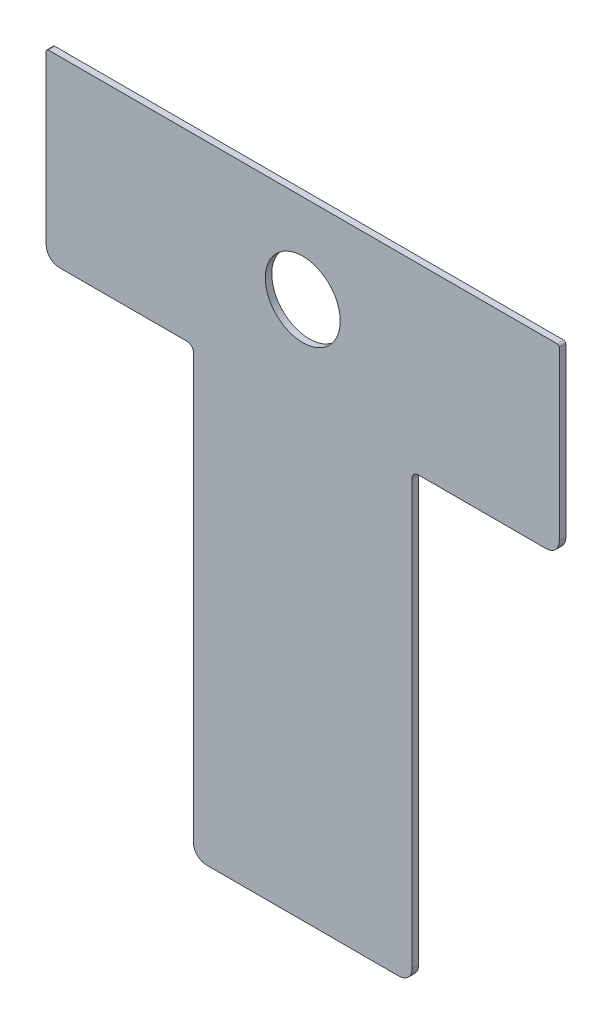
ISO-10303-21;
HEADER;
FILE_DESCRIPTION(('STEP AP214'),'2;1');
FILE_NAME('part.step','',(''),(''),'','','');
FILE_SCHEMA(('AUTOMOTIVE_DESIGN { 1 0 10303 214 1 1 1 1 }'));
ENDSEC;
DATA;
#1=APPLICATION_CONTEXT('core data for automotive mechanical design processes');
#2=APPLICATION_PROTOCOL_DEFINITION('international standard','automotive_design',2000,#1);
#3=PRODUCT_CONTEXT('',#1,'mechanical');
#4=PRODUCT('Part','Part','',(#3));
#5=PRODUCT_RELATED_PRODUCT_CATEGORY('part','',(#4));
#6=PRODUCT_DEFINITION_FORMATION('','',#4);
#7=PRODUCT_DEFINITION_CONTEXT('part definition',#1,'design');
#8=PRODUCT_DEFINITION('design','',#6,#7);
#9=PRODUCT_DEFINITION_SHAPE('','',#8);
#10=(LENGTH_UNIT() NAMED_UNIT(*) SI_UNIT(.MILLI.,.METRE.));
#11=(NAMED_UNIT(*) PLANE_ANGLE_UNIT() SI_UNIT($,.RADIAN.));
#12=(NAMED_UNIT(*) SI_UNIT($,.STERADIAN.) SOLID_ANGLE_UNIT());
#13=UNCERTAINTY_MEASURE_WITH_UNIT(LENGTH_MEASURE(1.E-05),#10,'distance_accuracy_value','');
#14=(GEOMETRIC_REPRESENTATION_CONTEXT(3) GLOBAL_UNCERTAINTY_ASSIGNED_CONTEXT((#13)) GLOBAL_UNIT_ASSIGNED_CONTEXT((#10,
#11,#12)) REPRESENTATION_CONTEXT('',''));
#15=CARTESIAN_POINT('',(0.,0.,0.));
#16=DIRECTION('',(0.,0.,1.));
#17=DIRECTION('',(1.,0.,0.));
#18=AXIS2_PLACEMENT_3D('',#15,#16,#17);
#19=CARTESIAN_POINT('',(-58.75,145.,93.3500000000006));
#20=DIRECTION('',(0.,0.,1.));
#21=DIRECTION('',(0.,-1.,0.));
#22=AXIS2_PLACEMENT_3D('',#19,#20,#21);
#23=CYLINDRICAL_SURFACE('',#22,0.500000000000004);
#24=DIRECTION('',(0.,0.,-1.));
#25=VECTOR('',#24,1.);
#26=CARTESIAN_POINT('',(-59.25,145.,94.1));
#27=LINE('',#26,#25);
#28=CARTESIAN_POINT('',(-59.25,145.,94.8499999999997));
#29=VERTEX_POINT('',#28);
#30=CARTESIAN_POINT('',(-59.25,145.,93.3500000000007));
#31=VERTEX_POINT('',#30);
#32=EDGE_CURVE('E142',#29,#31,#27,.T.);
#33=ORIENTED_EDGE('',*,*,#32,.F.);
#34=CARTESIAN_POINT('',(-58.75,145.,94.8499999999994));
#35=DIRECTION('',(0.,0.,1.));
#36=DIRECTION('',(0.,-1.,0.));
#37=AXIS2_PLACEMENT_3D('',#34,#35,#36);
#38=CIRCLE('',#37,0.500000000000004);
#39=CARTESIAN_POINT('',(-58.75,145.5,94.8499999999997));
#40=VERTEX_POINT('',#39);
#41=EDGE_CURVE('E20',#40,#29,#38,.T.);
#42=ORIENTED_EDGE('',*,*,#41,.F.);
#43=DIRECTION('',(0.,0.,1.));
#44=VECTOR('',#43,1.);
#45=CARTESIAN_POINT('',(-58.75,145.5,94.1));
#46=LINE('',#45,#44);
#47=CARTESIAN_POINT('',(-58.75,145.5,93.3500000000007));
#48=VERTEX_POINT('',#47);
#49=EDGE_CURVE('E196',#48,#40,#46,.T.);
#50=ORIENTED_EDGE('',*,*,#49,.F.);
#51=CARTESIAN_POINT('',(-58.75,145.,93.3500000000006));
#52=DIRECTION('',(0.,0.,1.));
#53=DIRECTION('',(0.,-1.,0.));
#54=AXIS2_PLACEMENT_3D('',#51,#52,#53);
#55=CIRCLE('',#54,0.500000000000004);
#56=EDGE_CURVE('E143',#31,#48,#55,.F.);
#57=ORIENTED_EDGE('',*,*,#56,.F.);
#58=EDGE_LOOP('',(#33,#42,#50,#57));
#59=FACE_BOUND('',#58,.T.);
#60=ADVANCED_FACE('F16',(#59),#23,.T.);
#61=CARTESIAN_POINT('',(58.75,145.,93.3500000000006));
#62=DIRECTION('',(0.,0.,1.));
#63=DIRECTION('',(1.,0.,0.));
#64=AXIS2_PLACEMENT_3D('',#61,#62,#63);
#65=CYLINDRICAL_SURFACE('',#64,0.499999999999973);
#66=DIRECTION('',(0.,0.,-1.));
#67=VECTOR('',#66,1.);
#68=CARTESIAN_POINT('',(58.75,145.5,94.1));
#69=LINE('',#68,#67);
#70=CARTESIAN_POINT('',(58.75,145.5,94.8499999999997));
#71=VERTEX_POINT('',#70);
#72=CARTESIAN_POINT('',(58.75,145.5,93.3500000000007));
#73=VERTEX_POINT('',#72);
#74=EDGE_CURVE('E199',#71,#73,#69,.T.);
#75=ORIENTED_EDGE('',*,*,#74,.F.);
#76=CARTESIAN_POINT('',(58.75,145.,94.8499999999994));
#77=DIRECTION('',(0.,0.,1.));
#78=DIRECTION('',(1.,0.,0.));
#79=AXIS2_PLACEMENT_3D('',#76,#77,#78);
#80=CIRCLE('',#79,0.499999999999973);
#81=CARTESIAN_POINT('',(59.25,145.,94.8499999999997));
#82=VERTEX_POINT('',#81);
#83=EDGE_CURVE('E140',#82,#71,#80,.T.);
#84=ORIENTED_EDGE('',*,*,#83,.F.);
#85=DIRECTION('',(0.,0.,1.));
#86=VECTOR('',#85,1.);
#87=CARTESIAN_POINT('',(59.25,145.,94.1));
#88=LINE('',#87,#86);
#89=CARTESIAN_POINT('',(59.25,145.,93.3500000000007));
#90=VERTEX_POINT('',#89);
#91=EDGE_CURVE('E192',#90,#82,#88,.T.);
#92=ORIENTED_EDGE('',*,*,#91,.F.);
#93=CARTESIAN_POINT('',(58.75,145.,93.3500000000006));
#94=DIRECTION('',(0.,0.,1.));
#95=DIRECTION('',(1.,0.,0.));
#96=AXIS2_PLACEMENT_3D('',#93,#94,#95);
#97=CIRCLE('',#96,0.499999999999973);
#98=EDGE_CURVE('E216',#73,#90,#97,.F.);
#99=ORIENTED_EDGE('',*,*,#98,.F.);
#100=EDGE_LOOP('',(#75,#84,#92,#99));
#101=FACE_BOUND('',#100,.T.);
#102=ADVANCED_FACE('F260',(#101),#65,.T.);
#103=CARTESIAN_POINT('',(-61.62,148.395,93.35));
#104=DIRECTION('',(0.,0.,-1.));
#105=DIRECTION('',(1.,0.,0.));
#106=AXIS2_PLACEMENT_3D('',#103,#104,#105);
#107=PLANE('',#106);
#108=CARTESIAN_POINT('',(0.,125.,93.3500000000006));
#109=DIRECTION('',(0.,0.,1.));
#110=DIRECTION('',(0.,-1.,0.));
#111=AXIS2_PLACEMENT_3D('',#108,#109,#110);
#112=CIRCLE('',#111,8.65);
#113=CARTESIAN_POINT('',(0.,116.35,93.3500000000006));
#114=VERTEX_POINT('',#113);
#115=EDGE_CURVE('E166',#114,#114,#112,.F.);
#116=ORIENTED_EDGE('',*,*,#115,.F.);
#117=EDGE_LOOP('',(#116));
#118=FACE_BOUND('',#117,.T.);
#119=DIRECTION('',(0.,-1.,0.));
#120=VECTOR('',#119,1.);
#121=CARTESIAN_POINT('',(-25.25,52.75,93.3500000000008));
#122=LINE('',#121,#120);
#123=CARTESIAN_POINT('',(-25.25,101.75,93.3500000000007));
#124=VERTEX_POINT('',#123);
#125=CARTESIAN_POINT('',(-25.25,3.75000000000016,93.3500000000007));
#126=VERTEX_POINT('',#125);
#127=EDGE_CURVE('E214',#124,#126,#122,.T.);
#128=ORIENTED_EDGE('',*,*,#127,.F.);
#129=CARTESIAN_POINT('',(-26.75,101.75,93.3500000000006));
#130=DIRECTION('',(0.,0.,-1.));
#131=DIRECTION('',(-1.,0.,0.));
#132=AXIS2_PLACEMENT_3D('',#129,#130,#131);
#133=CIRCLE('',#132,1.5);
#134=CARTESIAN_POINT('',(-26.75,103.25,93.3500000000007));
#135=VERTEX_POINT('',#134);
#136=EDGE_CURVE('E211',#135,#124,#133,.T.);
#137=ORIENTED_EDGE('',*,*,#136,.F.);
#138=DIRECTION('',(1.,0.,0.));
#139=VECTOR('',#138,1.);
#140=CARTESIAN_POINT('',(-41.5,103.25,93.3500000000008));
#141=LINE('',#140,#139);
#142=CARTESIAN_POINT('',(-56.25,103.25,93.3500000000007));
#143=VERTEX_POINT('',#142);
#144=EDGE_CURVE('E206',#143,#135,#141,.T.);
#145=ORIENTED_EDGE('',*,*,#144,.F.);
#146=CARTESIAN_POINT('',(-56.25,106.25,93.3500000000006));
#147=DIRECTION('',(0.,0.,1.));
#148=DIRECTION('',(1.,0.,0.));
#149=AXIS2_PLACEMENT_3D('',#146,#147,#148);
#150=CIRCLE('',#149,2.99999999999999);
#151=CARTESIAN_POINT('',(-59.25,106.25,93.3500000000007));
#152=VERTEX_POINT('',#151);
#153=EDGE_CURVE('E201',#143,#152,#150,.F.);
#154=ORIENTED_EDGE('',*,*,#153,.T.);
#155=DIRECTION('',(0.,-1.,0.));
#156=VECTOR('',#155,1.);
#157=CARTESIAN_POINT('',(-59.25,125.625,93.3500000000008));
#158=LINE('',#157,#156);
#159=EDGE_CURVE('E147',#31,#152,#158,.T.);
#160=ORIENTED_EDGE('',*,*,#159,.F.);
#161=ORIENTED_EDGE('',*,*,#56,.T.);
#162=DIRECTION('',(-1.,0.,0.));
#163=VECTOR('',#162,1.);
#164=CARTESIAN_POINT('',(0.,145.5,93.3500000000008));
#165=LINE('',#164,#163);
#166=EDGE_CURVE('E198',#73,#48,#165,.T.);
#167=ORIENTED_EDGE('',*,*,#166,.F.);
#168=ORIENTED_EDGE('',*,*,#98,.T.);
#169=DIRECTION('',(0.,1.,0.));
#170=VECTOR('',#169,1.);
#171=CARTESIAN_POINT('',(59.25,125.625,93.3500000000008));
#172=LINE('',#171,#170);
#173=CARTESIAN_POINT('',(59.25,106.25,93.3500000000007));
#174=VERTEX_POINT('',#173);
#175=EDGE_CURVE('E195',#174,#90,#172,.T.);
#176=ORIENTED_EDGE('',*,*,#175,.F.);
#177=CARTESIAN_POINT('',(56.25,106.25,93.3500000000006));
#178=DIRECTION('',(0.,0.,1.));
#179=DIRECTION('',(0.,-1.,0.));
#180=AXIS2_PLACEMENT_3D('',#177,#178,#179);
#181=CIRCLE('',#180,3.00000000000001);
#182=CARTESIAN_POINT('',(56.25,103.25,93.3500000000007));
#183=VERTEX_POINT('',#182);
#184=EDGE_CURVE('E191',#174,#183,#181,.F.);
#185=ORIENTED_EDGE('',*,*,#184,.T.);
#186=DIRECTION('',(1.,0.,0.));
#187=VECTOR('',#186,1.);
#188=CARTESIAN_POINT('',(41.5,103.25,93.3500000000008));
#189=LINE('',#188,#187);
#190=CARTESIAN_POINT('',(26.75,103.25,93.3500000000007));
#191=VERTEX_POINT('',#190);
#192=EDGE_CURVE('E187',#191,#183,#189,.T.);
#193=ORIENTED_EDGE('',*,*,#192,.F.);
#194=CARTESIAN_POINT('',(26.75,101.75,93.3500000000006));
#195=DIRECTION('',(0.,0.,-1.));
#196=DIRECTION('',(-1.,0.,0.));
#197=AXIS2_PLACEMENT_3D('',#194,#195,#196);
#198=CIRCLE('',#197,1.50000000000002);
#199=CARTESIAN_POINT('',(25.25,101.75,93.3500000000007));
#200=VERTEX_POINT('',#199);
#201=EDGE_CURVE('E184',#200,#191,#198,.T.);
#202=ORIENTED_EDGE('',*,*,#201,.F.);
#203=DIRECTION('',(0.,1.,0.));
#204=VECTOR('',#203,1.);
#205=CARTESIAN_POINT('',(25.25,52.75,93.3500000000008));
#206=LINE('',#205,#204);
#207=CARTESIAN_POINT('',(25.25,3.75,93.3500000000007));
#208=VERTEX_POINT('',#207);
#209=EDGE_CURVE('E179',#208,#200,#206,.T.);
#210=ORIENTED_EDGE('',*,*,#209,.F.);
#211=CARTESIAN_POINT('',(22.25,3.75,93.3500000000006));
#212=DIRECTION('',(0.,0.,1.));
#213=DIRECTION('',(0.,-1.,0.));
#214=AXIS2_PLACEMENT_3D('',#211,#212,#213);
#215=CIRCLE('',#214,3.);
#216=CARTESIAN_POINT('',(22.25,0.75,93.3500000000007));
#217=VERTEX_POINT('',#216);
#218=EDGE_CURVE('E175',#208,#217,#215,.F.);
#219=ORIENTED_EDGE('',*,*,#218,.T.);
#220=DIRECTION('',(1.,0.,0.));
#221=VECTOR('',#220,1.);
#222=CARTESIAN_POINT('',(0.,0.75,93.3500000000008));
#223=LINE('',#222,#221);
#224=CARTESIAN_POINT('',(-22.25,0.75,93.3500000000007));
#225=VERTEX_POINT('',#224);
#226=EDGE_CURVE('E170',#225,#217,#223,.T.);
#227=ORIENTED_EDGE('',*,*,#226,.F.);
#228=CARTESIAN_POINT('',(-22.25,3.75,93.3500000000006));
#229=DIRECTION('',(0.,0.,1.));
#230=DIRECTION('',(1.,0.,0.));
#231=AXIS2_PLACEMENT_3D('',#228,#229,#230);
#232=CIRCLE('',#231,3.);
#233=EDGE_CURVE('E172',#225,#126,#232,.F.);
#234=ORIENTED_EDGE('',*,*,#233,.T.);
#235=EDGE_LOOP('',(#128,#137,#145,#154,#160,#161,#167,#168,#176,#185,#193,#202,#210,#219,#227,#234));
#236=FACE_BOUND('',#235,.T.);
#237=ADVANCED_FACE('F266',(#118,#236),#107,.T.);
#238=CARTESIAN_POINT('',(-25.25,1.79,95.08817763308));
#239=DIRECTION('',(-1.,0.,0.));
#240=DIRECTION('',(0.,1.,0.));
#241=AXIS2_PLACEMENT_3D('',#238,#239,#240);
#242=PLANE('',#241);
#243=DIRECTION('',(0.,0.,1.));
#244=VECTOR('',#243,1.);
#245=CARTESIAN_POINT('',(-25.25,3.75000000000031,94.1));
#246=LINE('',#245,#244);
#247=CARTESIAN_POINT('',(-25.25,3.75000000000015,94.8499999999997));
#248=VERTEX_POINT('',#247);
#249=EDGE_CURVE('E167',#126,#248,#246,.T.);
#250=ORIENTED_EDGE('',*,*,#249,.T.);
#251=DIRECTION('',(0.,1.,0.));
#252=VECTOR('',#251,1.);
#253=CARTESIAN_POINT('',(-25.25,73.125,94.85));
#254=LINE('',#253,#252);
#255=CARTESIAN_POINT('',(-25.25,101.75,94.8499999999997));
#256=VERTEX_POINT('',#255);
#257=EDGE_CURVE('E163',#248,#256,#254,.T.);
#258=ORIENTED_EDGE('',*,*,#257,.T.);
#259=DIRECTION('',(0.,0.,1.));
#260=VECTOR('',#259,1.);
#261=CARTESIAN_POINT('',(-25.25,101.75,94.1));
#262=LINE('',#261,#260);
#263=EDGE_CURVE('E209',#124,#256,#262,.T.);
#264=ORIENTED_EDGE('',*,*,#263,.F.);
#265=ORIENTED_EDGE('',*,*,#127,.T.);
#266=EDGE_LOOP('',(#250,#258,#264,#265));
#267=FACE_BOUND('',#266,.T.);
#268=ADVANCED_FACE('F279',(#267),#242,.T.);
#269=CARTESIAN_POINT('',(-26.75,101.75,94.8499999999994));
#270=DIRECTION('',(0.,0.,-1.));
#271=DIRECTION('',(-1.,0.,0.));
#272=AXIS2_PLACEMENT_3D('',#269,#270,#271);
#273=CYLINDRICAL_SURFACE('',#272,1.5);
#274=ORIENTED_EDGE('',*,*,#263,.T.);
#275=CARTESIAN_POINT('',(-26.75,101.75,94.8499999999994));
#276=DIRECTION('',(0.,0.,-1.));
#277=DIRECTION('',(-1.,0.,0.));
#278=AXIS2_PLACEMENT_3D('',#275,#276,#277);
#279=CIRCLE('',#278,1.5);
#280=CARTESIAN_POINT('',(-26.75,103.25,94.8499999999997));
#281=VERTEX_POINT('',#280);
#282=EDGE_CURVE('E162',#256,#281,#279,.F.);
#283=ORIENTED_EDGE('',*,*,#282,.T.);
#284=DIRECTION('',(0.,0.,1.));
#285=VECTOR('',#284,1.);
#286=CARTESIAN_POINT('',(-26.75,103.25,94.1));
#287=LINE('',#286,#285);
#288=EDGE_CURVE('E207',#135,#281,#287,.T.);
#289=ORIENTED_EDGE('',*,*,#288,.F.);
#290=ORIENTED_EDGE('',*,*,#136,.T.);
#291=EDGE_LOOP('',(#274,#283,#289,#290));
#292=FACE_BOUND('',#291,.T.);
#293=ADVANCED_FACE('F276',(#292),#273,.F.);
#294=CARTESIAN_POINT('',(-26.16,103.25,95.08817763308));
#295=DIRECTION('',(0.,-1.,0.));
#296=DIRECTION('',(-1.,0.,0.));
#297=AXIS2_PLACEMENT_3D('',#294,#295,#296);
#298=PLANE('',#297);
#299=DIRECTION('',(0.,0.,-1.));
#300=VECTOR('',#299,1.);
#301=CARTESIAN_POINT('',(-56.25,103.25,94.1));
#302=LINE('',#301,#300);
#303=CARTESIAN_POINT('',(-56.25,103.25,94.8499999999997));
#304=VERTEX_POINT('',#303);
#305=EDGE_CURVE('E203',#304,#143,#302,.T.);
#306=ORIENTED_EDGE('',*,*,#305,.T.);
#307=ORIENTED_EDGE('',*,*,#144,.T.);
#308=ORIENTED_EDGE('',*,*,#288,.T.);
#309=DIRECTION('',(-1.,0.,0.));
#310=VECTOR('',#309,1.);
#311=CARTESIAN_POINT('',(0.,103.25,94.85));
#312=LINE('',#311,#310);
#313=EDGE_CURVE('E156',#281,#304,#312,.T.);
#314=ORIENTED_EDGE('',*,*,#313,.T.);
#315=EDGE_LOOP('',(#306,#307,#308,#314));
#316=FACE_BOUND('',#315,.T.);
#317=ADVANCED_FACE('F273',(#316),#298,.T.);
#318=CARTESIAN_POINT('',(-56.25,106.25,93.3500000000006));
#319=DIRECTION('',(0.,0.,1.));
#320=DIRECTION('',(1.,0.,0.));
#321=AXIS2_PLACEMENT_3D('',#318,#319,#320);
#322=CYLINDRICAL_SURFACE('',#321,2.99999999999999);
#323=ORIENTED_EDGE('',*,*,#305,.F.);
#324=CARTESIAN_POINT('',(-56.25,106.25,94.8499999999994));
#325=DIRECTION('',(0.,0.,1.));
#326=DIRECTION('',(1.,0.,0.));
#327=AXIS2_PLACEMENT_3D('',#324,#325,#326);
#328=CIRCLE('',#327,2.99999999999999);
#329=CARTESIAN_POINT('',(-59.25,106.25,94.8499999999997));
#330=VERTEX_POINT('',#329);
#331=EDGE_CURVE('E152',#304,#330,#328,.F.);
#332=ORIENTED_EDGE('',*,*,#331,.T.);
#333=DIRECTION('',(0.,0.,1.));
#334=VECTOR('',#333,1.);
#335=CARTESIAN_POINT('',(-59.25,106.25,94.1));
#336=LINE('',#335,#334);
#337=EDGE_CURVE('E148',#152,#330,#336,.T.);
#338=ORIENTED_EDGE('',*,*,#337,.F.);
#339=ORIENTED_EDGE('',*,*,#153,.F.);
#340=EDGE_LOOP('',(#323,#332,#338,#339));
#341=FACE_BOUND('',#340,.T.);
#342=ADVANCED_FACE('F269',(#341),#322,.T.);
#343=CARTESIAN_POINT('',(-59.25,105.475,95.08817763308));
#344=DIRECTION('',(-1.,0.,0.));
#345=DIRECTION('',(0.,1.,0.));
#346=AXIS2_PLACEMENT_3D('',#343,#344,#345);
#347=PLANE('',#346);
#348=ORIENTED_EDGE('',*,*,#32,.T.);
#349=ORIENTED_EDGE('',*,*,#159,.T.);
#350=ORIENTED_EDGE('',*,*,#337,.T.);
#351=DIRECTION('',(0.,1.,0.));
#352=VECTOR('',#351,1.);
#353=CARTESIAN_POINT('',(-59.25,73.125,94.85));
#354=LINE('',#353,#352);
#355=EDGE_CURVE('E136',#330,#29,#354,.T.);
#356=ORIENTED_EDGE('',*,*,#355,.T.);
#357=EDGE_LOOP('',(#348,#349,#350,#356));
#358=FACE_BOUND('',#357,.T.);
#359=ADVANCED_FACE('F150',(#358),#347,.T.);
#360=CARTESIAN_POINT('',(-61.1,145.5,95.08817763308));
#361=DIRECTION('',(0.,1.,0.));
#362=DIRECTION('',(1.,0.,0.));
#363=AXIS2_PLACEMENT_3D('',#360,#361,#362);
#364=PLANE('',#363);
#365=ORIENTED_EDGE('',*,*,#49,.T.);
#366=DIRECTION('',(1.,0.,0.));
#367=VECTOR('',#366,1.);
#368=CARTESIAN_POINT('',(0.,145.5,94.85));
#369=LINE('',#368,#367);
#370=EDGE_CURVE('E139',#40,#71,#369,.T.);
#371=ORIENTED_EDGE('',*,*,#370,.T.);
#372=ORIENTED_EDGE('',*,*,#74,.T.);
#373=ORIENTED_EDGE('',*,*,#166,.T.);
#374=EDGE_LOOP('',(#365,#371,#372,#373));
#375=FACE_BOUND('',#374,.T.);
#376=ADVANCED_FACE('F263',(#375),#364,.T.);
#377=CARTESIAN_POINT('',(59.25,145.775,95.08817763308));
#378=DIRECTION('',(1.,0.,0.));
#379=DIRECTION('',(0.,-1.,0.));
#380=AXIS2_PLACEMENT_3D('',#377,#378,#379);
#381=PLANE('',#380);
#382=ORIENTED_EDGE('',*,*,#91,.T.);
#383=DIRECTION('',(0.,-1.,0.));
#384=VECTOR('',#383,1.);
#385=CARTESIAN_POINT('',(59.25,73.125,94.85));
#386=LINE('',#385,#384);
#387=CARTESIAN_POINT('',(59.25,106.25,94.8499999999997));
#388=VERTEX_POINT('',#387);
#389=EDGE_CURVE('E154',#82,#388,#386,.T.);
#390=ORIENTED_EDGE('',*,*,#389,.T.);
#391=DIRECTION('',(0.,0.,-1.));
#392=VECTOR('',#391,1.);
#393=CARTESIAN_POINT('',(59.25,106.25,94.1));
#394=LINE('',#393,#392);
#395=EDGE_CURVE('E188',#388,#174,#394,.T.);
#396=ORIENTED_EDGE('',*,*,#395,.T.);
#397=ORIENTED_EDGE('',*,*,#175,.T.);
#398=EDGE_LOOP('',(#382,#390,#396,#397));
#399=FACE_BOUND('',#398,.T.);
#400=ADVANCED_FACE('F293',(#399),#381,.T.);
#401=CARTESIAN_POINT('',(56.25,106.25,93.3500000000006));
#402=DIRECTION('',(0.,0.,1.));
#403=DIRECTION('',(0.,-1.,0.));
#404=AXIS2_PLACEMENT_3D('',#401,#402,#403);
#405=CYLINDRICAL_SURFACE('',#404,3.00000000000001);
#406=ORIENTED_EDGE('',*,*,#395,.F.);
#407=CARTESIAN_POINT('',(56.25,106.25,94.8499999999994));
#408=DIRECTION('',(0.,0.,1.));
#409=DIRECTION('',(0.,-1.,0.));
#410=AXIS2_PLACEMENT_3D('',#407,#408,#409);
#411=CIRCLE('',#410,3.00000000000001);
#412=CARTESIAN_POINT('',(56.25,103.25,94.8499999999997));
#413=VERTEX_POINT('',#412);
#414=EDGE_CURVE('E237',#388,#413,#411,.F.);
#415=ORIENTED_EDGE('',*,*,#414,.T.);
#416=DIRECTION('',(0.,0.,1.));
#417=VECTOR('',#416,1.);
#418=CARTESIAN_POINT('',(56.25,103.25,94.1));
#419=LINE('',#418,#417);
#420=EDGE_CURVE('E185',#183,#413,#419,.T.);
#421=ORIENTED_EDGE('',*,*,#420,.F.);
#422=ORIENTED_EDGE('',*,*,#184,.F.);
#423=EDGE_LOOP('',(#406,#415,#421,#422));
#424=FACE_BOUND('',#423,.T.);
#425=ADVANCED_FACE('F298',(#424),#405,.T.);
#426=CARTESIAN_POINT('',(56.84,103.25,95.08817763308));
#427=DIRECTION('',(0.,-1.,0.));
#428=DIRECTION('',(-1.,0.,0.));
#429=AXIS2_PLACEMENT_3D('',#426,#427,#428);
#430=PLANE('',#429);
#431=ORIENTED_EDGE('',*,*,#420,.T.);
#432=DIRECTION('',(-1.,0.,0.));
#433=VECTOR('',#432,1.);
#434=CARTESIAN_POINT('',(0.,103.25,94.85));
#435=LINE('',#434,#433);
#436=CARTESIAN_POINT('',(26.75,103.25,94.8499999999997));
#437=VERTEX_POINT('',#436);
#438=EDGE_CURVE('E236',#413,#437,#435,.T.);
#439=ORIENTED_EDGE('',*,*,#438,.T.);
#440=DIRECTION('',(0.,0.,1.));
#441=VECTOR('',#440,1.);
#442=CARTESIAN_POINT('',(26.75,103.25,94.1));
#443=LINE('',#442,#441);
#444=EDGE_CURVE('E182',#191,#437,#443,.T.);
#445=ORIENTED_EDGE('',*,*,#444,.F.);
#446=ORIENTED_EDGE('',*,*,#192,.T.);
#447=EDGE_LOOP('',(#431,#439,#445,#446));
#448=FACE_BOUND('',#447,.T.);
#449=ADVANCED_FACE('F301',(#448),#430,.T.);
#450=CARTESIAN_POINT('',(26.75,101.75,94.8499999999994));
#451=DIRECTION('',(0.,0.,-1.));
#452=DIRECTION('',(-1.,0.,0.));
#453=AXIS2_PLACEMENT_3D('',#450,#451,#452);
#454=CYLINDRICAL_SURFACE('',#453,1.50000000000002);
#455=ORIENTED_EDGE('',*,*,#444,.T.);
#456=CARTESIAN_POINT('',(26.75,101.75,94.8499999999994));
#457=DIRECTION('',(0.,0.,-1.));
#458=DIRECTION('',(-1.,0.,0.));
#459=AXIS2_PLACEMENT_3D('',#456,#457,#458);
#460=CIRCLE('',#459,1.50000000000002);
#461=CARTESIAN_POINT('',(25.25,101.75,94.8499999999997));
#462=VERTEX_POINT('',#461);
#463=EDGE_CURVE('E233',#437,#462,#460,.F.);
#464=ORIENTED_EDGE('',*,*,#463,.T.);
#465=DIRECTION('',(0.,0.,1.));
#466=VECTOR('',#465,1.);
#467=CARTESIAN_POINT('',(25.25,101.75,94.1));
#468=LINE('',#467,#466);
#469=EDGE_CURVE('E180',#200,#462,#468,.T.);
#470=ORIENTED_EDGE('',*,*,#469,.F.);
#471=ORIENTED_EDGE('',*,*,#201,.T.);
#472=EDGE_LOOP('',(#455,#464,#470,#471));
#473=FACE_BOUND('',#472,.T.);
#474=ADVANCED_FACE('F307',(#473),#454,.F.);
#475=CARTESIAN_POINT('',(25.25,103.71,95.08817763308));
#476=DIRECTION('',(1.,0.,0.));
#477=DIRECTION('',(0.,-1.,0.));
#478=AXIS2_PLACEMENT_3D('',#475,#476,#477);
#479=PLANE('',#478);
#480=DIRECTION('',(0.,0.,-1.));
#481=VECTOR('',#480,1.);
#482=CARTESIAN_POINT('',(25.25,3.75,94.1));
#483=LINE('',#482,#481);
#484=CARTESIAN_POINT('',(25.25,3.75,94.8499999999997));
#485=VERTEX_POINT('',#484);
#486=EDGE_CURVE('E176',#485,#208,#483,.T.);
#487=ORIENTED_EDGE('',*,*,#486,.T.);
#488=ORIENTED_EDGE('',*,*,#209,.T.);
#489=ORIENTED_EDGE('',*,*,#469,.T.);
#490=DIRECTION('',(0.,-1.,0.));
#491=VECTOR('',#490,1.);
#492=CARTESIAN_POINT('',(25.25,73.125,94.85));
#493=LINE('',#492,#491);
#494=EDGE_CURVE('E232',#462,#485,#493,.T.);
#495=ORIENTED_EDGE('',*,*,#494,.T.);
#496=EDGE_LOOP('',(#487,#488,#489,#495));
#497=FACE_BOUND('',#496,.T.);
#498=ADVANCED_FACE('F310',(#497),#479,.T.);
#499=CARTESIAN_POINT('',(22.25,3.75,93.3500000000006));
#500=DIRECTION('',(0.,0.,1.));
#501=DIRECTION('',(0.,-1.,0.));
#502=AXIS2_PLACEMENT_3D('',#499,#500,#501);
#503=CYLINDRICAL_SURFACE('',#502,3.);
#504=ORIENTED_EDGE('',*,*,#486,.F.);
#505=CARTESIAN_POINT('',(22.25,3.75,94.8499999999994));
#506=DIRECTION('',(0.,0.,1.));
#507=DIRECTION('',(0.,-1.,0.));
#508=AXIS2_PLACEMENT_3D('',#505,#506,#507);
#509=CIRCLE('',#508,3.);
#510=CARTESIAN_POINT('',(22.25,0.750000000000004,94.8499999999997));
#511=VERTEX_POINT('',#510);
#512=EDGE_CURVE('E229',#485,#511,#509,.F.);
#513=ORIENTED_EDGE('',*,*,#512,.T.);
#514=DIRECTION('',(0.,0.,1.));
#515=VECTOR('',#514,1.);
#516=CARTESIAN_POINT('',(22.25,0.75,94.1));
#517=LINE('',#516,#515);
#518=EDGE_CURVE('E173',#217,#511,#517,.T.);
#519=ORIENTED_EDGE('',*,*,#518,.F.);
#520=ORIENTED_EDGE('',*,*,#218,.F.);
#521=EDGE_LOOP('',(#504,#513,#519,#520));
#522=FACE_BOUND('',#521,.T.);
#523=ADVANCED_FACE('F312',(#522),#503,.T.);
#524=CARTESIAN_POINT('',(23.14,0.75,95.08817763308));
#525=DIRECTION('',(0.,-1.,0.));
#526=DIRECTION('',(-1.,0.,0.));
#527=AXIS2_PLACEMENT_3D('',#524,#525,#526);
#528=PLANE('',#527);
#529=DIRECTION('',(0.,0.,-1.));
#530=VECTOR('',#529,1.);
#531=CARTESIAN_POINT('',(-22.25,0.75,94.1));
#532=LINE('',#531,#530);
#533=CARTESIAN_POINT('',(-22.25,0.750000000000004,94.8499999999997));
#534=VERTEX_POINT('',#533);
#535=EDGE_CURVE('E35',#534,#225,#532,.T.);
#536=ORIENTED_EDGE('',*,*,#535,.T.);
#537=ORIENTED_EDGE('',*,*,#226,.T.);
#538=ORIENTED_EDGE('',*,*,#518,.T.);
#539=DIRECTION('',(-1.,0.,0.));
#540=VECTOR('',#539,1.);
#541=CARTESIAN_POINT('',(0.,0.750000000000005,94.85));
#542=LINE('',#541,#540);
#543=EDGE_CURVE('E228',#511,#534,#542,.T.);
#544=ORIENTED_EDGE('',*,*,#543,.T.);
#545=EDGE_LOOP('',(#536,#537,#538,#544));
#546=FACE_BOUND('',#545,.T.);
#547=ADVANCED_FACE('F285',(#546),#528,.T.);
#548=CARTESIAN_POINT('',(-22.25,3.75,93.3500000000006));
#549=DIRECTION('',(0.,0.,1.));
#550=DIRECTION('',(1.,0.,0.));
#551=AXIS2_PLACEMENT_3D('',#548,#549,#550);
#552=CYLINDRICAL_SURFACE('',#551,3.);
#553=ORIENTED_EDGE('',*,*,#535,.F.);
#554=CARTESIAN_POINT('',(-22.25,3.75,94.8499999999994));
#555=DIRECTION('',(0.,0.,1.));
#556=DIRECTION('',(1.,0.,0.));
#557=AXIS2_PLACEMENT_3D('',#554,#555,#556);
#558=CIRCLE('',#557,3.);
#559=EDGE_CURVE('E26',#534,#248,#558,.F.);
#560=ORIENTED_EDGE('',*,*,#559,.T.);
#561=ORIENTED_EDGE('',*,*,#249,.F.);
#562=ORIENTED_EDGE('',*,*,#233,.F.);
#563=EDGE_LOOP('',(#553,#560,#561,#562));
#564=FACE_BOUND('',#563,.T.);
#565=ADVANCED_FACE('F281',(#564),#552,.T.);
#566=CARTESIAN_POINT('',(0.,125.,93.3500000000006));
#567=DIRECTION('',(0.,0.,1.));
#568=DIRECTION('',(0.,-1.,0.));
#569=AXIS2_PLACEMENT_3D('',#566,#567,#568);
#570=CYLINDRICAL_SURFACE('',#569,8.65);
#571=ORIENTED_EDGE('',*,*,#115,.T.);
#572=EDGE_LOOP('',(#571));
#573=FACE_BOUND('',#572,.T.);
#574=CARTESIAN_POINT('',(0.,125.,94.8499999999994));
#575=DIRECTION('',(0.,0.,1.));
#576=DIRECTION('',(0.,-1.,0.));
#577=AXIS2_PLACEMENT_3D('',#574,#575,#576);
#578=CIRCLE('',#577,8.65);
#579=CARTESIAN_POINT('',(0.,116.35,94.8499999999994));
#580=VERTEX_POINT('',#579);
#581=EDGE_CURVE('E11',#580,#580,#578,.T.);
#582=ORIENTED_EDGE('',*,*,#581,.T.);
#583=EDGE_LOOP('',(#582));
#584=FACE_BOUND('',#583,.T.);
#585=ADVANCED_FACE('F324',(#573,#584),#570,.F.);
#586=CARTESIAN_POINT('',(-61.62,148.395,94.85));
#587=DIRECTION('',(0.,0.,-1.));
#588=DIRECTION('',(1.,0.,0.));
#589=AXIS2_PLACEMENT_3D('',#586,#587,#588);
#590=PLANE('',#589);
#591=ORIENTED_EDGE('',*,*,#581,.F.);
#592=EDGE_LOOP('',(#591));
#593=FACE_BOUND('',#592,.T.);
#594=ORIENTED_EDGE('',*,*,#543,.F.);
#595=ORIENTED_EDGE('',*,*,#512,.F.);
#596=ORIENTED_EDGE('',*,*,#494,.F.);
#597=ORIENTED_EDGE('',*,*,#463,.F.);
#598=ORIENTED_EDGE('',*,*,#438,.F.);
#599=ORIENTED_EDGE('',*,*,#414,.F.);
#600=ORIENTED_EDGE('',*,*,#389,.F.);
#601=ORIENTED_EDGE('',*,*,#83,.T.);
#602=ORIENTED_EDGE('',*,*,#370,.F.);
#603=ORIENTED_EDGE('',*,*,#41,.T.);
#604=ORIENTED_EDGE('',*,*,#355,.F.);
#605=ORIENTED_EDGE('',*,*,#331,.F.);
#606=ORIENTED_EDGE('',*,*,#313,.F.);
#607=ORIENTED_EDGE('',*,*,#282,.F.);
#608=ORIENTED_EDGE('',*,*,#257,.F.);
#609=ORIENTED_EDGE('',*,*,#559,.F.);
#610=EDGE_LOOP('',(#594,#595,#596,#597,#598,#599,#600,#601,#602,#603,#604,#605,#606,#607,#608,#609));
#611=FACE_BOUND('',#610,.T.);
#612=ADVANCED_FACE('F18',(#593,#611),#590,.F.);
#613=CLOSED_SHELL('',(#60,#102,#237,#268,#293,#317,#342,#359,#376,#400,#425,#449,#474,#498,#523,
#547,#565,#585,#612));
#614=MANIFOLD_SOLID_BREP('B1',#613);
#615=ADVANCED_BREP_SHAPE_REPRESENTATION('',(#18,#614),#14);
#616=SHAPE_DEFINITION_REPRESENTATION(#9,#615);
ENDSEC;
END-ISO-10303-21;
